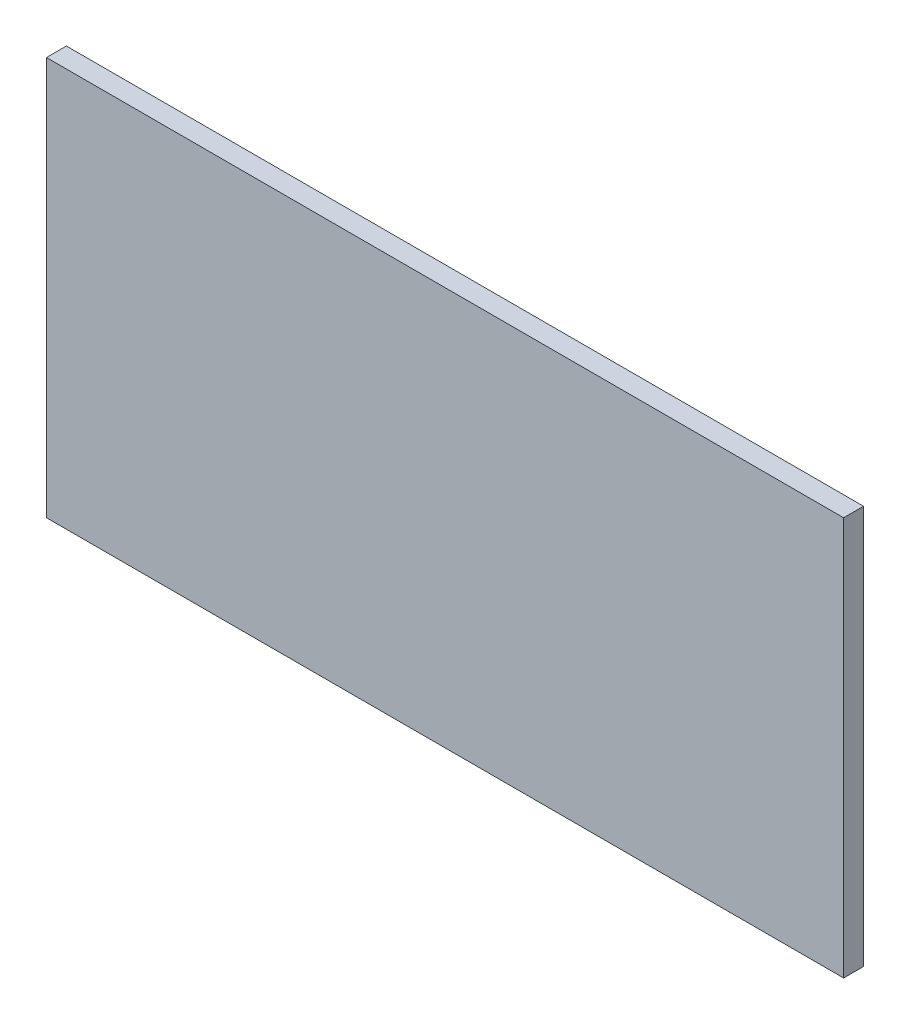
ISO-10303-21;
HEADER;
FILE_DESCRIPTION(('STEP AP214'),'2;1');
FILE_NAME('part.step','',(''),(''),'','','');
FILE_SCHEMA(('AUTOMOTIVE_DESIGN { 1 0 10303 214 1 1 1 1 }'));
ENDSEC;
DATA;
#1=APPLICATION_CONTEXT('core data for automotive mechanical design processes');
#2=APPLICATION_PROTOCOL_DEFINITION('international standard','automotive_design',2000,#1);
#3=PRODUCT_CONTEXT('',#1,'mechanical');
#4=PRODUCT('Part','Part','',(#3));
#5=PRODUCT_RELATED_PRODUCT_CATEGORY('part','',(#4));
#6=PRODUCT_DEFINITION_FORMATION('','',#4);
#7=PRODUCT_DEFINITION_CONTEXT('part definition',#1,'design');
#8=PRODUCT_DEFINITION('design','',#6,#7);
#9=PRODUCT_DEFINITION_SHAPE('','',#8);
#10=(LENGTH_UNIT() NAMED_UNIT(*) SI_UNIT(.MILLI.,.METRE.));
#11=(NAMED_UNIT(*) PLANE_ANGLE_UNIT() SI_UNIT($,.RADIAN.));
#12=(NAMED_UNIT(*) SI_UNIT($,.STERADIAN.) SOLID_ANGLE_UNIT());
#13=UNCERTAINTY_MEASURE_WITH_UNIT(LENGTH_MEASURE(1.E-05),#10,'distance_accuracy_value','');
#14=(GEOMETRIC_REPRESENTATION_CONTEXT(3) GLOBAL_UNCERTAINTY_ASSIGNED_CONTEXT((#13)) GLOBAL_UNIT_ASSIGNED_CONTEXT((#10,
#11,#12)) REPRESENTATION_CONTEXT('',''));
#15=CARTESIAN_POINT('',(0.,0.,0.));
#16=DIRECTION('',(0.,0.,1.));
#17=DIRECTION('',(1.,0.,0.));
#18=AXIS2_PLACEMENT_3D('',#15,#16,#17);
#19=CARTESIAN_POINT('',(0.,0.,25.));
#20=DIRECTION('',(0.,1.,0.));
#21=DIRECTION('',(0.,0.,1.));
#22=AXIS2_PLACEMENT_3D('',#19,#20,#21);
#23=PLANE('',#22);
#24=DIRECTION('',(0.,0.,-1.));
#25=VECTOR('',#24,1.);
#26=CARTESIAN_POINT('',(975.,0.,25.));
#27=LINE('',#26,#25);
#28=CARTESIAN_POINT('',(975.,0.,25.));
#29=VERTEX_POINT('',#28);
#30=CARTESIAN_POINT('',(975.,0.,0.));
#31=VERTEX_POINT('',#30);
#32=EDGE_CURVE('E11',#29,#31,#27,.T.);
#33=ORIENTED_EDGE('',*,*,#32,.F.);
#34=DIRECTION('',(1.,0.,0.));
#35=VECTOR('',#34,1.);
#36=CARTESIAN_POINT('',(0.,0.,25.));
#37=LINE('',#36,#35);
#38=CARTESIAN_POINT('',(25.,0.,25.));
#39=VERTEX_POINT('',#38);
#40=EDGE_CURVE('E100',#39,#29,#37,.T.);
#41=ORIENTED_EDGE('',*,*,#40,.F.);
#42=DIRECTION('',(0.,0.,-1.));
#43=VECTOR('',#42,1.);
#44=CARTESIAN_POINT('',(25.,0.,25.));
#45=LINE('',#44,#43);
#46=CARTESIAN_POINT('',(25.,0.,0.));
#47=VERTEX_POINT('',#46);
#48=EDGE_CURVE('E48',#39,#47,#45,.T.);
#49=ORIENTED_EDGE('',*,*,#48,.T.);
#50=DIRECTION('',(1.,0.,0.));
#51=VECTOR('',#50,1.);
#52=CARTESIAN_POINT('',(0.,0.,0.));
#53=LINE('',#52,#51);
#54=EDGE_CURVE('E131',#47,#31,#53,.T.);
#55=ORIENTED_EDGE('',*,*,#54,.T.);
#56=EDGE_LOOP('',(#33,#41,#49,#55));
#57=FACE_BOUND('',#56,.T.);
#58=ADVANCED_FACE('F39',(#57),#23,.F.);
#59=ORIENTED_EDGE('',*,*,#48,.F.);
#60=CARTESIAN_POINT('',(0.,0.,25.));
#61=VERTEX_POINT('',#60);
#62=EDGE_CURVE('E90',#61,#39,#37,.T.);
#63=ORIENTED_EDGE('',*,*,#62,.F.);
#64=DIRECTION('',(0.,0.,-1.));
#65=VECTOR('',#64,1.);
#66=CARTESIAN_POINT('',(0.,0.,25.));
#67=LINE('',#66,#65);
#68=CARTESIAN_POINT('',(0.,0.,0.));
#69=VERTEX_POINT('',#68);
#70=EDGE_CURVE('E95',#61,#69,#67,.T.);
#71=ORIENTED_EDGE('',*,*,#70,.T.);
#72=EDGE_CURVE('E129',#69,#47,#53,.T.);
#73=ORIENTED_EDGE('',*,*,#72,.T.);
#74=EDGE_LOOP('',(#59,#63,#71,#73));
#75=FACE_BOUND('',#74,.T.);
#76=ADVANCED_FACE('F92',(#75),#23,.F.);
#77=CARTESIAN_POINT('',(0.,0.,25.));
#78=DIRECTION('',(1.,0.,0.));
#79=DIRECTION('',(0.,0.,-1.));
#80=AXIS2_PLACEMENT_3D('',#77,#78,#79);
#81=PLANE('',#80);
#82=DIRECTION('',(0.,-1.,0.));
#83=VECTOR('',#82,1.);
#84=CARTESIAN_POINT('',(0.,0.,0.));
#85=LINE('',#84,#83);
#86=CARTESIAN_POINT('',(0.,500.,0.));
#87=VERTEX_POINT('',#86);
#88=EDGE_CURVE('E114',#87,#69,#85,.T.);
#89=ORIENTED_EDGE('',*,*,#88,.T.);
#90=ORIENTED_EDGE('',*,*,#70,.F.);
#91=DIRECTION('',(0.,-1.,0.));
#92=VECTOR('',#91,1.);
#93=CARTESIAN_POINT('',(0.,0.,25.));
#94=LINE('',#93,#92);
#95=CARTESIAN_POINT('',(0.,500.,25.));
#96=VERTEX_POINT('',#95);
#97=EDGE_CURVE('E104',#96,#61,#94,.T.);
#98=ORIENTED_EDGE('',*,*,#97,.F.);
#99=DIRECTION('',(0.,0.,-1.));
#100=VECTOR('',#99,1.);
#101=CARTESIAN_POINT('',(0.,500.,25.));
#102=LINE('',#101,#100);
#103=EDGE_CURVE('E124',#96,#87,#102,.T.);
#104=ORIENTED_EDGE('',*,*,#103,.T.);
#105=EDGE_LOOP('',(#89,#90,#98,#104));
#106=FACE_BOUND('',#105,.T.);
#107=ADVANCED_FACE('F41',(#106),#81,.F.);
#108=CARTESIAN_POINT('',(1000.,0.,25.));
#109=VERTEX_POINT('',#108);
#110=EDGE_CURVE('E102',#29,#109,#37,.T.);
#111=ORIENTED_EDGE('',*,*,#110,.F.);
#112=ORIENTED_EDGE('',*,*,#32,.T.);
#113=CARTESIAN_POINT('',(1000.,0.,0.));
#114=VERTEX_POINT('',#113);
#115=EDGE_CURVE('E132',#31,#114,#53,.T.);
#116=ORIENTED_EDGE('',*,*,#115,.T.);
#117=DIRECTION('',(0.,0.,-1.));
#118=VECTOR('',#117,1.);
#119=CARTESIAN_POINT('',(1000.,0.,25.));
#120=LINE('',#119,#118);
#121=EDGE_CURVE('E115',#109,#114,#120,.T.);
#122=ORIENTED_EDGE('',*,*,#121,.F.);
#123=EDGE_LOOP('',(#111,#112,#116,#122));
#124=FACE_BOUND('',#123,.T.);
#125=ADVANCED_FACE('F147',(#124),#23,.F.);
#126=CARTESIAN_POINT('',(1000.,0.,25.));
#127=DIRECTION('',(-1.,0.,0.));
#128=DIRECTION('',(0.,0.,1.));
#129=AXIS2_PLACEMENT_3D('',#126,#127,#128);
#130=PLANE('',#129);
#131=DIRECTION('',(0.,1.,0.));
#132=VECTOR('',#131,1.);
#133=CARTESIAN_POINT('',(1000.,0.,0.));
#134=LINE('',#133,#132);
#135=CARTESIAN_POINT('',(1000.,500.,0.));
#136=VERTEX_POINT('',#135);
#137=EDGE_CURVE('E127',#114,#136,#134,.T.);
#138=ORIENTED_EDGE('',*,*,#137,.T.);
#139=DIRECTION('',(0.,0.,-1.));
#140=VECTOR('',#139,1.);
#141=CARTESIAN_POINT('',(1000.,500.,25.));
#142=LINE('',#141,#140);
#143=CARTESIAN_POINT('',(1000.,500.,25.));
#144=VERTEX_POINT('',#143);
#145=EDGE_CURVE('E119',#144,#136,#142,.T.);
#146=ORIENTED_EDGE('',*,*,#145,.F.);
#147=DIRECTION('',(0.,1.,0.));
#148=VECTOR('',#147,1.);
#149=CARTESIAN_POINT('',(1000.,0.,25.));
#150=LINE('',#149,#148);
#151=EDGE_CURVE('E99',#109,#144,#150,.T.);
#152=ORIENTED_EDGE('',*,*,#151,.F.);
#153=ORIENTED_EDGE('',*,*,#121,.T.);
#154=EDGE_LOOP('',(#138,#146,#152,#153));
#155=FACE_BOUND('',#154,.T.);
#156=ADVANCED_FACE('F139',(#155),#130,.F.);
#157=CARTESIAN_POINT('',(0.,500.,25.));
#158=DIRECTION('',(0.,-1.,0.));
#159=DIRECTION('',(0.,0.,-1.));
#160=AXIS2_PLACEMENT_3D('',#157,#158,#159);
#161=PLANE('',#160);
#162=DIRECTION('',(-1.,0.,0.));
#163=VECTOR('',#162,1.);
#164=CARTESIAN_POINT('',(0.,500.,0.));
#165=LINE('',#164,#163);
#166=EDGE_CURVE('E111',#136,#87,#165,.T.);
#167=ORIENTED_EDGE('',*,*,#166,.T.);
#168=ORIENTED_EDGE('',*,*,#103,.F.);
#169=DIRECTION('',(-1.,0.,0.));
#170=VECTOR('',#169,1.);
#171=CARTESIAN_POINT('',(0.,500.,25.));
#172=LINE('',#171,#170);
#173=EDGE_CURVE('E107',#144,#96,#172,.T.);
#174=ORIENTED_EDGE('',*,*,#173,.F.);
#175=ORIENTED_EDGE('',*,*,#145,.T.);
#176=EDGE_LOOP('',(#167,#168,#174,#175));
#177=FACE_BOUND('',#176,.T.);
#178=ADVANCED_FACE('F143',(#177),#161,.F.);
#179=CARTESIAN_POINT('',(0.,0.,25.));
#180=DIRECTION('',(0.,0.,-1.));
#181=DIRECTION('',(-1.,0.,0.));
#182=AXIS2_PLACEMENT_3D('',#179,#180,#181);
#183=PLANE('',#182);
#184=ORIENTED_EDGE('',*,*,#97,.T.);
#185=ORIENTED_EDGE('',*,*,#62,.T.);
#186=ORIENTED_EDGE('',*,*,#40,.T.);
#187=ORIENTED_EDGE('',*,*,#110,.T.);
#188=ORIENTED_EDGE('',*,*,#151,.T.);
#189=ORIENTED_EDGE('',*,*,#173,.T.);
#190=EDGE_LOOP('',(#184,#185,#186,#187,#188,#189));
#191=FACE_BOUND('',#190,.T.);
#192=ADVANCED_FACE('F105',(#191),#183,.F.);
#193=CARTESIAN_POINT('',(0.,0.,0.));
#194=DIRECTION('',(0.,0.,-1.));
#195=DIRECTION('',(-1.,0.,0.));
#196=AXIS2_PLACEMENT_3D('',#193,#194,#195);
#197=PLANE('',#196);
#198=ORIENTED_EDGE('',*,*,#88,.F.);
#199=ORIENTED_EDGE('',*,*,#166,.F.);
#200=ORIENTED_EDGE('',*,*,#137,.F.);
#201=ORIENTED_EDGE('',*,*,#115,.F.);
#202=ORIENTED_EDGE('',*,*,#54,.F.);
#203=ORIENTED_EDGE('',*,*,#72,.F.);
#204=EDGE_LOOP('',(#198,#199,#200,#201,#202,#203));
#205=FACE_BOUND('',#204,.T.);
#206=ADVANCED_FACE('F145',(#205),#197,.T.);
#207=CLOSED_SHELL('',(#58,#76,#107,#125,#156,#178,#192,#206));
#208=MANIFOLD_SOLID_BREP('B2',#207);
#209=ADVANCED_BREP_SHAPE_REPRESENTATION('',(#18,#208),#14);
#210=SHAPE_DEFINITION_REPRESENTATION(#9,#209);
ENDSEC;
END-ISO-10303-21;
